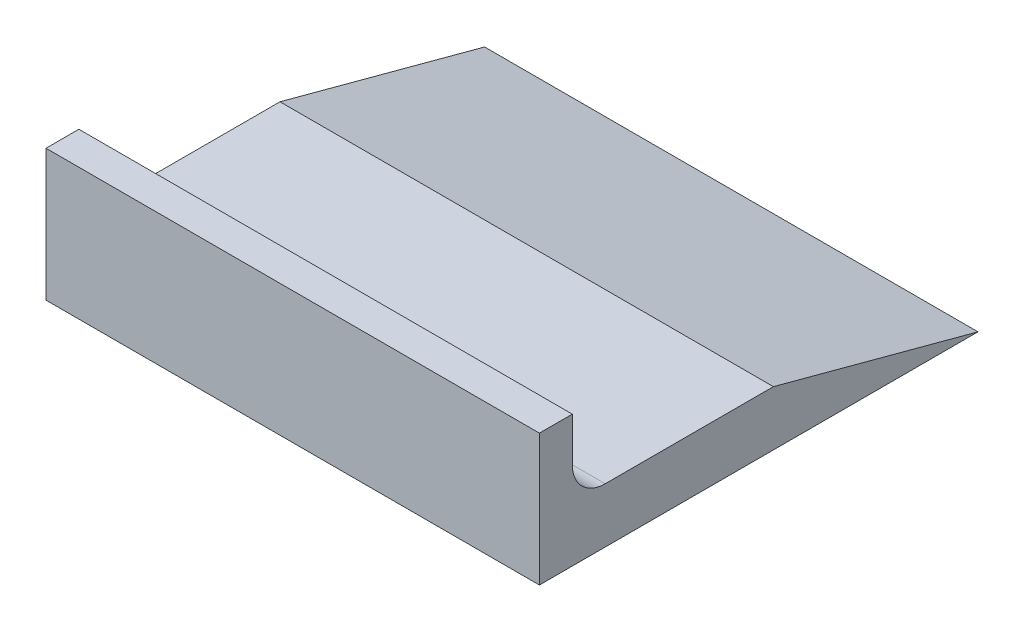
ISO-10303-21;
HEADER;
FILE_DESCRIPTION(('STEP AP214'),'2;1');
FILE_NAME('part.step','',(''),(''),'','','');
FILE_SCHEMA(('AUTOMOTIVE_DESIGN { 1 0 10303 214 1 1 1 1 }'));
ENDSEC;
DATA;
#1=APPLICATION_CONTEXT('core data for automotive mechanical design processes');
#2=APPLICATION_PROTOCOL_DEFINITION('international standard','automotive_design',2000,#1);
#3=PRODUCT_CONTEXT('',#1,'mechanical');
#4=PRODUCT('Part','Part','',(#3));
#5=PRODUCT_RELATED_PRODUCT_CATEGORY('part','',(#4));
#6=PRODUCT_DEFINITION_FORMATION('','',#4);
#7=PRODUCT_DEFINITION_CONTEXT('part definition',#1,'design');
#8=PRODUCT_DEFINITION('design','',#6,#7);
#9=PRODUCT_DEFINITION_SHAPE('','',#8);
#10=(LENGTH_UNIT() NAMED_UNIT(*) SI_UNIT(.MILLI.,.METRE.));
#11=(NAMED_UNIT(*) PLANE_ANGLE_UNIT() SI_UNIT($,.RADIAN.));
#12=(NAMED_UNIT(*) SI_UNIT($,.STERADIAN.) SOLID_ANGLE_UNIT());
#13=UNCERTAINTY_MEASURE_WITH_UNIT(LENGTH_MEASURE(1.E-05),#10,'distance_accuracy_value','');
#14=(GEOMETRIC_REPRESENTATION_CONTEXT(3) GLOBAL_UNCERTAINTY_ASSIGNED_CONTEXT((#13)) GLOBAL_UNIT_ASSIGNED_CONTEXT((#10,
#11,#12)) REPRESENTATION_CONTEXT('',''));
#15=CARTESIAN_POINT('',(0.,0.,0.));
#16=DIRECTION('',(0.,0.,1.));
#17=DIRECTION('',(1.,0.,0.));
#18=AXIS2_PLACEMENT_3D('',#15,#16,#17);
#19=CARTESIAN_POINT('',(22.5,5.,-20.));
#20=DIRECTION('',(-1.,0.,0.));
#21=DIRECTION('',(0.,0.,1.));
#22=AXIS2_PLACEMENT_3D('',#19,#20,#21);
#23=PLANE('',#22);
#24=DIRECTION('',(0.,0.,-1.));
#25=VECTOR('',#24,1.);
#26=CARTESIAN_POINT('',(22.5,0.,-20.));
#27=LINE('',#26,#25);
#28=CARTESIAN_POINT('',(22.5,0.,20.));
#29=VERTEX_POINT('',#28);
#30=CARTESIAN_POINT('',(22.5,0.,-20.));
#31=VERTEX_POINT('',#30);
#32=EDGE_CURVE('E125',#29,#31,#27,.T.);
#33=ORIENTED_EDGE('',*,*,#32,.T.);
#34=DIRECTION('',(0.,0.258819045102521,0.965925826289068));
#35=VECTOR('',#34,1.);
#36=CARTESIAN_POINT('',(22.5,5.,-1.33974596215565));
#37=LINE('',#36,#35);
#38=CARTESIAN_POINT('',(22.5,5.,-1.33974596215565));
#39=VERTEX_POINT('',#38);
#40=EDGE_CURVE('E143',#31,#39,#37,.T.);
#41=ORIENTED_EDGE('',*,*,#40,.T.);
#42=DIRECTION('',(0.,0.,-1.));
#43=VECTOR('',#42,1.);
#44=CARTESIAN_POINT('',(22.5,5.,-20.));
#45=LINE('',#44,#43);
#46=CARTESIAN_POINT('',(22.5,5.,14.));
#47=VERTEX_POINT('',#46);
#48=EDGE_CURVE('E126',#47,#39,#45,.T.);
#49=ORIENTED_EDGE('',*,*,#48,.F.);
#50=CARTESIAN_POINT('',(22.5,8.,14.));
#51=DIRECTION('',(-1.,0.,0.));
#52=DIRECTION('',(0.,0.,1.));
#53=AXIS2_PLACEMENT_3D('',#50,#51,#52);
#54=CIRCLE('',#53,3.);
#55=CARTESIAN_POINT('',(22.5,8.,17.));
#56=VERTEX_POINT('',#55);
#57=EDGE_CURVE('E11',#47,#56,#54,.T.);
#58=ORIENTED_EDGE('',*,*,#57,.T.);
#59=DIRECTION('',(0.,-1.,0.));
#60=VECTOR('',#59,1.);
#61=CARTESIAN_POINT('',(22.5,12.,17.));
#62=LINE('',#61,#60);
#63=CARTESIAN_POINT('',(22.5,12.,17.));
#64=VERTEX_POINT('',#63);
#65=EDGE_CURVE('E122',#64,#56,#62,.T.);
#66=ORIENTED_EDGE('',*,*,#65,.F.);
#67=DIRECTION('',(0.,0.,-1.));
#68=VECTOR('',#67,1.);
#69=CARTESIAN_POINT('',(22.5,12.,20.));
#70=LINE('',#69,#68);
#71=CARTESIAN_POINT('',(22.5,12.,20.));
#72=VERTEX_POINT('',#71);
#73=EDGE_CURVE('E110',#72,#64,#70,.T.);
#74=ORIENTED_EDGE('',*,*,#73,.F.);
#75=DIRECTION('',(0.,-1.,0.));
#76=VECTOR('',#75,1.);
#77=CARTESIAN_POINT('',(22.5,5.,20.));
#78=LINE('',#77,#76);
#79=EDGE_CURVE('E102',#72,#29,#78,.T.);
#80=ORIENTED_EDGE('',*,*,#79,.T.);
#81=EDGE_LOOP('',(#33,#41,#49,#58,#66,#74,#80));
#82=FACE_BOUND('',#81,.T.);
#83=ADVANCED_FACE('F35',(#82),#23,.F.);
#84=CARTESIAN_POINT('',(-22.5,5.,-20.));
#85=DIRECTION('',(1.,0.,0.));
#86=DIRECTION('',(0.,0.,-1.));
#87=AXIS2_PLACEMENT_3D('',#84,#85,#86);
#88=PLANE('',#87);
#89=DIRECTION('',(0.,0.,1.));
#90=VECTOR('',#89,1.);
#91=CARTESIAN_POINT('',(-22.5,5.,-20.));
#92=LINE('',#91,#90);
#93=CARTESIAN_POINT('',(-22.5,5.,-1.33974596215565));
#94=VERTEX_POINT('',#93);
#95=CARTESIAN_POINT('',(-22.5,5.,14.));
#96=VERTEX_POINT('',#95);
#97=EDGE_CURVE('E128',#94,#96,#92,.T.);
#98=ORIENTED_EDGE('',*,*,#97,.F.);
#99=DIRECTION('',(0.,-0.258819045102521,-0.965925826289068));
#100=VECTOR('',#99,1.);
#101=CARTESIAN_POINT('',(-22.5,5.,-1.33974596215565));
#102=LINE('',#101,#100);
#103=CARTESIAN_POINT('',(-22.5,0.,-20.));
#104=VERTEX_POINT('',#103);
#105=EDGE_CURVE('E141',#94,#104,#102,.T.);
#106=ORIENTED_EDGE('',*,*,#105,.T.);
#107=DIRECTION('',(0.,0.,1.));
#108=VECTOR('',#107,1.);
#109=CARTESIAN_POINT('',(-22.5,0.,-20.));
#110=LINE('',#109,#108);
#111=CARTESIAN_POINT('',(-22.5,0.,20.));
#112=VERTEX_POINT('',#111);
#113=EDGE_CURVE('E98',#104,#112,#110,.T.);
#114=ORIENTED_EDGE('',*,*,#113,.T.);
#115=DIRECTION('',(0.,-1.,0.));
#116=VECTOR('',#115,1.);
#117=CARTESIAN_POINT('',(-22.5,5.,20.));
#118=LINE('',#117,#116);
#119=CARTESIAN_POINT('',(-22.5,12.,20.));
#120=VERTEX_POINT('',#119);
#121=EDGE_CURVE('E92',#120,#112,#118,.T.);
#122=ORIENTED_EDGE('',*,*,#121,.F.);
#123=DIRECTION('',(0.,0.,1.));
#124=VECTOR('',#123,1.);
#125=CARTESIAN_POINT('',(-22.5,12.,20.));
#126=LINE('',#125,#124);
#127=CARTESIAN_POINT('',(-22.5,12.,17.));
#128=VERTEX_POINT('',#127);
#129=EDGE_CURVE('E96',#128,#120,#126,.T.);
#130=ORIENTED_EDGE('',*,*,#129,.F.);
#131=DIRECTION('',(0.,-1.,0.));
#132=VECTOR('',#131,1.);
#133=CARTESIAN_POINT('',(-22.5,12.,17.));
#134=LINE('',#133,#132);
#135=CARTESIAN_POINT('',(-22.5,8.,17.));
#136=VERTEX_POINT('',#135);
#137=EDGE_CURVE('E120',#128,#136,#134,.T.);
#138=ORIENTED_EDGE('',*,*,#137,.T.);
#139=CARTESIAN_POINT('',(-22.5,8.,14.));
#140=DIRECTION('',(1.,0.,0.));
#141=DIRECTION('',(0.,0.,-1.));
#142=AXIS2_PLACEMENT_3D('',#139,#140,#141);
#143=CIRCLE('',#142,3.);
#144=EDGE_CURVE('E43',#136,#96,#143,.T.);
#145=ORIENTED_EDGE('',*,*,#144,.T.);
#146=EDGE_LOOP('',(#98,#106,#114,#122,#130,#138,#145));
#147=FACE_BOUND('',#146,.T.);
#148=ADVANCED_FACE('F94',(#147),#88,.F.);
#149=CARTESIAN_POINT('',(-22.5,5.,20.));
#150=DIRECTION('',(0.,0.,-1.));
#151=DIRECTION('',(-1.,0.,0.));
#152=AXIS2_PLACEMENT_3D('',#149,#150,#151);
#153=PLANE('',#152);
#154=DIRECTION('',(1.,0.,0.));
#155=VECTOR('',#154,1.);
#156=CARTESIAN_POINT('',(-22.5,0.,20.));
#157=LINE('',#156,#155);
#158=EDGE_CURVE('E129',#112,#29,#157,.T.);
#159=ORIENTED_EDGE('',*,*,#158,.T.);
#160=ORIENTED_EDGE('',*,*,#79,.F.);
#161=DIRECTION('',(1.,0.,0.));
#162=VECTOR('',#161,1.);
#163=CARTESIAN_POINT('',(-22.5,12.,20.));
#164=LINE('',#163,#162);
#165=EDGE_CURVE('E105',#120,#72,#164,.T.);
#166=ORIENTED_EDGE('',*,*,#165,.F.);
#167=ORIENTED_EDGE('',*,*,#121,.T.);
#168=EDGE_LOOP('',(#159,#160,#166,#167));
#169=FACE_BOUND('',#168,.T.);
#170=ADVANCED_FACE('F106',(#169),#153,.F.);
#171=CARTESIAN_POINT('',(0.,5.,0.));
#172=DIRECTION('',(0.,1.,0.));
#173=DIRECTION('',(0.,0.,1.));
#174=AXIS2_PLACEMENT_3D('',#171,#172,#173);
#175=PLANE('',#174);
#176=ORIENTED_EDGE('',*,*,#97,.T.);
#177=DIRECTION('',(-1.,0.,0.));
#178=VECTOR('',#177,1.);
#179=CARTESIAN_POINT('',(0.,5.,14.));
#180=LINE('',#179,#178);
#181=EDGE_CURVE('E56',#96,#47,#180,.F.);
#182=ORIENTED_EDGE('',*,*,#181,.T.);
#183=ORIENTED_EDGE('',*,*,#48,.T.);
#184=DIRECTION('',(-1.,0.,0.));
#185=VECTOR('',#184,1.);
#186=CARTESIAN_POINT('',(-22.5,5.,-1.33974596215565));
#187=LINE('',#186,#185);
#188=EDGE_CURVE('E101',#39,#94,#187,.T.);
#189=ORIENTED_EDGE('',*,*,#188,.T.);
#190=EDGE_LOOP('',(#176,#182,#183,#189));
#191=FACE_BOUND('',#190,.T.);
#192=ADVANCED_FACE('F158',(#191),#175,.T.);
#193=CARTESIAN_POINT('',(0.,0.,0.));
#194=DIRECTION('',(0.,1.,0.));
#195=DIRECTION('',(0.,0.,1.));
#196=AXIS2_PLACEMENT_3D('',#193,#194,#195);
#197=PLANE('',#196);
#198=ORIENTED_EDGE('',*,*,#32,.F.);
#199=ORIENTED_EDGE('',*,*,#158,.F.);
#200=ORIENTED_EDGE('',*,*,#113,.F.);
#201=DIRECTION('',(-1.,0.,0.));
#202=VECTOR('',#201,1.);
#203=CARTESIAN_POINT('',(-22.5,0.,-20.));
#204=LINE('',#203,#202);
#205=EDGE_CURVE('E133',#31,#104,#204,.T.);
#206=ORIENTED_EDGE('',*,*,#205,.F.);
#207=EDGE_LOOP('',(#198,#199,#200,#206));
#208=FACE_BOUND('',#207,.T.);
#209=ADVANCED_FACE('F162',(#208),#197,.F.);
#210=CARTESIAN_POINT('',(0.,5.,-1.33974596215565));
#211=DIRECTION('',(0.,0.965925826289068,-0.258819045102521));
#212=DIRECTION('',(1.,0.,0.));
#213=AXIS2_PLACEMENT_3D('',#210,#211,#212);
#214=PLANE('',#213);
#215=ORIENTED_EDGE('',*,*,#40,.F.);
#216=ORIENTED_EDGE('',*,*,#205,.T.);
#217=ORIENTED_EDGE('',*,*,#105,.F.);
#218=ORIENTED_EDGE('',*,*,#188,.F.);
#219=EDGE_LOOP('',(#215,#216,#217,#218));
#220=FACE_BOUND('',#219,.T.);
#221=ADVANCED_FACE('F163',(#220),#214,.T.);
#222=CARTESIAN_POINT('',(-22.5,12.,17.));
#223=DIRECTION('',(0.,0.,1.));
#224=DIRECTION('',(1.,0.,0.));
#225=AXIS2_PLACEMENT_3D('',#222,#223,#224);
#226=PLANE('',#225);
#227=ORIENTED_EDGE('',*,*,#65,.T.);
#228=DIRECTION('',(-1.,0.,0.));
#229=VECTOR('',#228,1.);
#230=CARTESIAN_POINT('',(-22.5,8.,17.));
#231=LINE('',#230,#229);
#232=EDGE_CURVE('E146',#56,#136,#231,.T.);
#233=ORIENTED_EDGE('',*,*,#232,.T.);
#234=ORIENTED_EDGE('',*,*,#137,.F.);
#235=DIRECTION('',(-1.,0.,0.));
#236=VECTOR('',#235,1.);
#237=CARTESIAN_POINT('',(-22.5,12.,17.));
#238=LINE('',#237,#236);
#239=EDGE_CURVE('E114',#64,#128,#238,.T.);
#240=ORIENTED_EDGE('',*,*,#239,.F.);
#241=EDGE_LOOP('',(#227,#233,#234,#240));
#242=FACE_BOUND('',#241,.T.);
#243=ADVANCED_FACE('F151',(#242),#226,.F.);
#244=CARTESIAN_POINT('',(0.,12.,0.));
#245=DIRECTION('',(0.,-1.,0.));
#246=DIRECTION('',(0.,0.,-1.));
#247=AXIS2_PLACEMENT_3D('',#244,#245,#246);
#248=PLANE('',#247);
#249=ORIENTED_EDGE('',*,*,#129,.T.);
#250=ORIENTED_EDGE('',*,*,#165,.T.);
#251=ORIENTED_EDGE('',*,*,#73,.T.);
#252=ORIENTED_EDGE('',*,*,#239,.T.);
#253=EDGE_LOOP('',(#249,#250,#251,#252));
#254=FACE_BOUND('',#253,.T.);
#255=ADVANCED_FACE('F112',(#254),#248,.F.);
#256=CARTESIAN_POINT('',(-22.5,8.,14.));
#257=DIRECTION('',(-1.,0.,0.));
#258=DIRECTION('',(0.,0.,1.));
#259=AXIS2_PLACEMENT_3D('',#256,#257,#258);
#260=CYLINDRICAL_SURFACE('',#259,3.);
#261=ORIENTED_EDGE('',*,*,#57,.F.);
#262=ORIENTED_EDGE('',*,*,#181,.F.);
#263=ORIENTED_EDGE('',*,*,#144,.F.);
#264=ORIENTED_EDGE('',*,*,#232,.F.);
#265=EDGE_LOOP('',(#261,#262,#263,#264));
#266=FACE_BOUND('',#265,.T.);
#267=ADVANCED_FACE('F37',(#266),#260,.F.);
#268=CLOSED_SHELL('',(#83,#148,#170,#192,#209,#221,#243,#255,#267));
#269=MANIFOLD_SOLID_BREP('B2',#268);
#270=ADVANCED_BREP_SHAPE_REPRESENTATION('',(#18,#269),#14);
#271=SHAPE_DEFINITION_REPRESENTATION(#9,#270);
ENDSEC;
END-ISO-10303-21;
